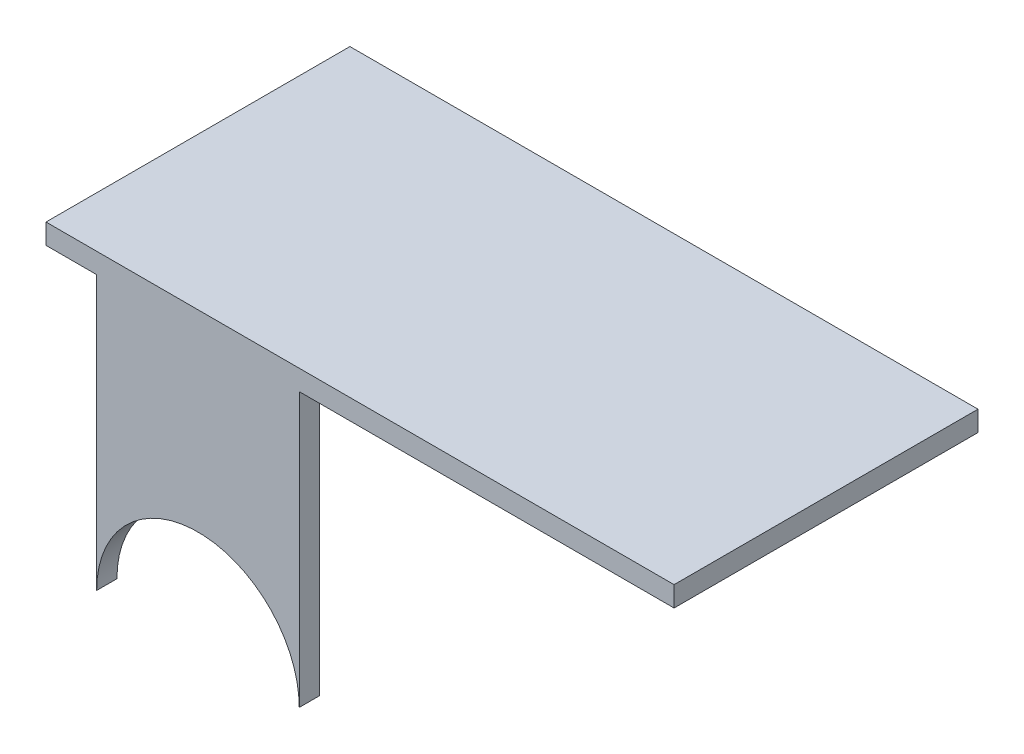
ISO-10303-21;
HEADER;
FILE_DESCRIPTION(('STEP AP214'),'2;1');
FILE_NAME('part.step','',(''),(''),'','','');
FILE_SCHEMA(('AUTOMOTIVE_DESIGN { 1 0 10303 214 1 1 1 1 }'));
ENDSEC;
DATA;
#1=APPLICATION_CONTEXT('core data for automotive mechanical design processes');
#2=APPLICATION_PROTOCOL_DEFINITION('international standard','automotive_design',2000,#1);
#3=PRODUCT_CONTEXT('',#1,'mechanical');
#4=PRODUCT('Part','Part','',(#3));
#5=PRODUCT_RELATED_PRODUCT_CATEGORY('part','',(#4));
#6=PRODUCT_DEFINITION_FORMATION('','',#4);
#7=PRODUCT_DEFINITION_CONTEXT('part definition',#1,'design');
#8=PRODUCT_DEFINITION('design','',#6,#7);
#9=PRODUCT_DEFINITION_SHAPE('','',#8);
#10=(LENGTH_UNIT() NAMED_UNIT(*) SI_UNIT(.MILLI.,.METRE.));
#11=(NAMED_UNIT(*) PLANE_ANGLE_UNIT() SI_UNIT($,.RADIAN.));
#12=(NAMED_UNIT(*) SI_UNIT($,.STERADIAN.) SOLID_ANGLE_UNIT());
#13=UNCERTAINTY_MEASURE_WITH_UNIT(LENGTH_MEASURE(1.E-05),#10,'distance_accuracy_value','');
#14=(GEOMETRIC_REPRESENTATION_CONTEXT(3) GLOBAL_UNCERTAINTY_ASSIGNED_CONTEXT((#13)) GLOBAL_UNIT_ASSIGNED_CONTEXT((#10,
#11,#12)) REPRESENTATION_CONTEXT('',''));
#15=CARTESIAN_POINT('',(0.,0.,0.));
#16=DIRECTION('',(0.,0.,1.));
#17=DIRECTION('',(1.,0.,0.));
#18=AXIS2_PLACEMENT_3D('',#15,#16,#17);
#19=CARTESIAN_POINT('',(-34.9249684990199,-5.13115650933468,2.));
#20=DIRECTION('',(0.,0.,-1.));
#21=DIRECTION('',(-1.,0.,0.));
#22=AXIS2_PLACEMENT_3D('',#19,#20,#21);
#23=CYLINDRICAL_SURFACE('',#22,10.);
#24=CARTESIAN_POINT('',(-34.9249684990199,-5.13115650933468,0.));
#25=DIRECTION('',(0.,0.,-1.));
#26=DIRECTION('',(-1.,0.,0.));
#27=AXIS2_PLACEMENT_3D('',#24,#25,#26);
#28=CIRCLE('',#27,10.);
#29=CARTESIAN_POINT('',(-44.9249684990199,-5.13115650933468,0.));
#30=VERTEX_POINT('',#29);
#31=CARTESIAN_POINT('',(-24.9249684990199,-5.13115650933468,0.));
#32=VERTEX_POINT('',#31);
#33=EDGE_CURVE('E137',#30,#32,#28,.T.);
#34=ORIENTED_EDGE('',*,*,#33,.T.);
#35=DIRECTION('',(0.,0.,-1.));
#36=VECTOR('',#35,1.);
#37=CARTESIAN_POINT('',(-24.9249684990199,-5.13115650933468,2.));
#38=LINE('',#37,#36);
#39=CARTESIAN_POINT('',(-24.9249684990199,-5.13115650933468,2.));
#40=VERTEX_POINT('',#39);
#41=EDGE_CURVE('E11',#40,#32,#38,.T.);
#42=ORIENTED_EDGE('',*,*,#41,.F.);
#43=CARTESIAN_POINT('',(-34.9249684990199,-5.13115650933468,2.));
#44=DIRECTION('',(0.,0.,-1.));
#45=DIRECTION('',(-1.,0.,0.));
#46=AXIS2_PLACEMENT_3D('',#43,#44,#45);
#47=CIRCLE('',#46,10.);
#48=CARTESIAN_POINT('',(-44.9249684990199,-5.13115650933468,2.));
#49=VERTEX_POINT('',#48);
#50=EDGE_CURVE('E148',#49,#40,#47,.T.);
#51=ORIENTED_EDGE('',*,*,#50,.F.);
#52=DIRECTION('',(0.,0.,-1.));
#53=VECTOR('',#52,1.);
#54=CARTESIAN_POINT('',(-44.9249684990199,-5.13115650933468,2.));
#55=LINE('',#54,#53);
#56=EDGE_CURVE('E154',#49,#30,#55,.T.);
#57=ORIENTED_EDGE('',*,*,#56,.T.);
#58=EDGE_LOOP('',(#34,#42,#51,#57));
#59=FACE_BOUND('',#58,.T.);
#60=ADVANCED_FACE('F39',(#59),#23,.F.);
#61=CARTESIAN_POINT('',(-24.9249684990199,21.8688434906653,2.));
#62=DIRECTION('',(-1.,0.,0.));
#63=DIRECTION('',(0.,-1.,0.));
#64=AXIS2_PLACEMENT_3D('',#61,#62,#63);
#65=PLANE('',#64);
#66=DIRECTION('',(0.,1.,0.));
#67=VECTOR('',#66,1.);
#68=CARTESIAN_POINT('',(-24.9249684990199,21.8688434906653,0.));
#69=LINE('',#68,#67);
#70=CARTESIAN_POINT('',(-24.9249684990199,21.8688434906653,0.));
#71=VERTEX_POINT('',#70);
#72=EDGE_CURVE('E142',#32,#71,#69,.T.);
#73=ORIENTED_EDGE('',*,*,#72,.T.);
#74=DIRECTION('',(0.,0.,-1.));
#75=VECTOR('',#74,1.);
#76=CARTESIAN_POINT('',(-24.9249684990199,21.8688434906653,2.));
#77=LINE('',#76,#75);
#78=CARTESIAN_POINT('',(-24.9249684990199,21.8688434906653,2.));
#79=VERTEX_POINT('',#78);
#80=EDGE_CURVE('E48',#79,#71,#77,.T.);
#81=ORIENTED_EDGE('',*,*,#80,.F.);
#82=DIRECTION('',(0.,1.,0.));
#83=VECTOR('',#82,1.);
#84=CARTESIAN_POINT('',(-24.9249684990199,21.8688434906653,2.));
#85=LINE('',#84,#83);
#86=EDGE_CURVE('E80',#40,#79,#85,.T.);
#87=ORIENTED_EDGE('',*,*,#86,.F.);
#88=ORIENTED_EDGE('',*,*,#41,.T.);
#89=EDGE_LOOP('',(#73,#81,#87,#88));
#90=FACE_BOUND('',#89,.T.);
#91=ADVANCED_FACE('F172',(#90),#65,.F.);
#92=CARTESIAN_POINT('',(-44.9249684990199,-5.13115650933468,2.));
#93=DIRECTION('',(1.,0.,0.));
#94=DIRECTION('',(0.,0.,-1.));
#95=AXIS2_PLACEMENT_3D('',#92,#93,#94);
#96=PLANE('',#95);
#97=DIRECTION('',(0.,-1.,0.));
#98=VECTOR('',#97,1.);
#99=CARTESIAN_POINT('',(-44.9249684990199,-5.13115650933468,0.));
#100=LINE('',#99,#98);
#101=CARTESIAN_POINT('',(-44.9249684990199,21.8688434906653,0.));
#102=VERTEX_POINT('',#101);
#103=EDGE_CURVE('E73',#102,#30,#100,.T.);
#104=ORIENTED_EDGE('',*,*,#103,.T.);
#105=ORIENTED_EDGE('',*,*,#56,.F.);
#106=DIRECTION('',(0.,-1.,0.));
#107=VECTOR('',#106,1.);
#108=CARTESIAN_POINT('',(-44.9249684990199,-5.13115650933468,2.));
#109=LINE('',#108,#107);
#110=CARTESIAN_POINT('',(-44.9249684990199,21.8688434906653,2.));
#111=VERTEX_POINT('',#110);
#112=EDGE_CURVE('E56',#111,#49,#109,.T.);
#113=ORIENTED_EDGE('',*,*,#112,.F.);
#114=DIRECTION('',(0.,0.,-1.));
#115=VECTOR('',#114,1.);
#116=CARTESIAN_POINT('',(-44.9249684990199,21.8688434906653,2.));
#117=LINE('',#116,#115);
#118=EDGE_CURVE('E70',#111,#102,#117,.T.);
#119=ORIENTED_EDGE('',*,*,#118,.T.);
#120=EDGE_LOOP('',(#104,#105,#113,#119));
#121=FACE_BOUND('',#120,.T.);
#122=ADVANCED_FACE('F179',(#121),#96,.F.);
#123=CARTESIAN_POINT('',(-34.9249684990199,-5.13115650933468,2.));
#124=DIRECTION('',(0.,0.,-1.));
#125=DIRECTION('',(-1.,0.,0.));
#126=AXIS2_PLACEMENT_3D('',#123,#124,#125);
#127=PLANE('',#126);
#128=ORIENTED_EDGE('',*,*,#50,.T.);
#129=ORIENTED_EDGE('',*,*,#86,.T.);
#130=DIRECTION('',(1.,0.,0.));
#131=VECTOR('',#130,1.);
#132=CARTESIAN_POINT('',(-44.9249684990199,21.8688434906653,2.));
#133=LINE('',#132,#131);
#134=CARTESIAN_POINT('',(12.0750315009801,21.8688434906653,2.));
#135=VERTEX_POINT('',#134);
#136=EDGE_CURVE('E134',#79,#135,#133,.T.);
#137=ORIENTED_EDGE('',*,*,#136,.T.);
#138=DIRECTION('',(0.,-1.,0.));
#139=VECTOR('',#138,1.);
#140=CARTESIAN_POINT('',(12.0750315009801,23.8688434906653,2.));
#141=LINE('',#140,#139);
#142=CARTESIAN_POINT('',(12.0750315009801,23.8688434906653,2.));
#143=VERTEX_POINT('',#142);
#144=EDGE_CURVE('E114',#143,#135,#141,.T.);
#145=ORIENTED_EDGE('',*,*,#144,.F.);
#146=DIRECTION('',(1.,0.,0.));
#147=VECTOR('',#146,1.);
#148=CARTESIAN_POINT('',(-44.9249684990199,23.8688434906653,2.));
#149=LINE('',#148,#147);
#150=CARTESIAN_POINT('',(-49.9249684990199,23.8688434906653,2.));
#151=VERTEX_POINT('',#150);
#152=EDGE_CURVE('E121',#151,#143,#149,.T.);
#153=ORIENTED_EDGE('',*,*,#152,.F.);
#154=DIRECTION('',(0.,-1.,0.));
#155=VECTOR('',#154,1.);
#156=CARTESIAN_POINT('',(-49.9249684990199,23.8688434906653,2.));
#157=LINE('',#156,#155);
#158=CARTESIAN_POINT('',(-49.9249684990199,21.8688434906653,2.));
#159=VERTEX_POINT('',#158);
#160=EDGE_CURVE('E182',#151,#159,#157,.T.);
#161=ORIENTED_EDGE('',*,*,#160,.T.);
#162=EDGE_CURVE('E130',#159,#111,#133,.T.);
#163=ORIENTED_EDGE('',*,*,#162,.T.);
#164=ORIENTED_EDGE('',*,*,#112,.T.);
#165=EDGE_LOOP('',(#128,#129,#137,#145,#153,#161,#163,#164));
#166=FACE_BOUND('',#165,.T.);
#167=ADVANCED_FACE('F132',(#166),#127,.F.);
#168=CARTESIAN_POINT('',(-34.9249684990199,-5.13115650933468,0.));
#169=DIRECTION('',(0.,0.,-1.));
#170=DIRECTION('',(-1.,0.,0.));
#171=AXIS2_PLACEMENT_3D('',#168,#169,#170);
#172=PLANE('',#171);
#173=ORIENTED_EDGE('',*,*,#33,.F.);
#174=ORIENTED_EDGE('',*,*,#103,.F.);
#175=DIRECTION('',(-1.,0.,0.));
#176=VECTOR('',#175,1.);
#177=CARTESIAN_POINT('',(-44.9249684990199,21.8688434906653,0.));
#178=LINE('',#177,#176);
#179=EDGE_CURVE('E159',#71,#102,#178,.T.);
#180=ORIENTED_EDGE('',*,*,#179,.F.);
#181=ORIENTED_EDGE('',*,*,#72,.F.);
#182=EDGE_LOOP('',(#173,#174,#180,#181));
#183=FACE_BOUND('',#182,.T.);
#184=ADVANCED_FACE('F176',(#183),#172,.T.);
#185=CARTESIAN_POINT('',(12.0750315009801,23.8688434906653,2.));
#186=DIRECTION('',(-1.,0.,0.));
#187=DIRECTION('',(0.,0.,1.));
#188=AXIS2_PLACEMENT_3D('',#185,#186,#187);
#189=PLANE('',#188);
#190=DIRECTION('',(0.,0.,-1.));
#191=VECTOR('',#190,1.);
#192=CARTESIAN_POINT('',(12.0750315009801,21.8688434906653,2.));
#193=LINE('',#192,#191);
#194=CARTESIAN_POINT('',(12.0750315009801,21.8688434906653,-28.));
#195=VERTEX_POINT('',#194);
#196=EDGE_CURVE('E201',#135,#195,#193,.T.);
#197=ORIENTED_EDGE('',*,*,#196,.T.);
#198=DIRECTION('',(0.,-1.,0.));
#199=VECTOR('',#198,1.);
#200=CARTESIAN_POINT('',(12.0750315009801,23.8688434906653,-28.));
#201=LINE('',#200,#199);
#202=CARTESIAN_POINT('',(12.0750315009801,23.8688434906653,-28.));
#203=VERTEX_POINT('',#202);
#204=EDGE_CURVE('E116',#203,#195,#201,.T.);
#205=ORIENTED_EDGE('',*,*,#204,.F.);
#206=DIRECTION('',(0.,0.,-1.));
#207=VECTOR('',#206,1.);
#208=CARTESIAN_POINT('',(12.0750315009801,23.8688434906653,2.));
#209=LINE('',#208,#207);
#210=EDGE_CURVE('E110',#143,#203,#209,.T.);
#211=ORIENTED_EDGE('',*,*,#210,.F.);
#212=ORIENTED_EDGE('',*,*,#144,.T.);
#213=EDGE_LOOP('',(#197,#205,#211,#212));
#214=FACE_BOUND('',#213,.T.);
#215=ADVANCED_FACE('F112',(#214),#189,.F.);
#216=CARTESIAN_POINT('',(-49.9249684990199,23.8688434906653,-28.));
#217=DIRECTION('',(0.,0.,1.));
#218=DIRECTION('',(1.,0.,0.));
#219=AXIS2_PLACEMENT_3D('',#216,#217,#218);
#220=PLANE('',#219);
#221=DIRECTION('',(-1.,0.,0.));
#222=VECTOR('',#221,1.);
#223=CARTESIAN_POINT('',(-49.9249684990199,21.8688434906653,-28.));
#224=LINE('',#223,#222);
#225=CARTESIAN_POINT('',(-49.9249684990199,21.8688434906653,-28.));
#226=VERTEX_POINT('',#225);
#227=EDGE_CURVE('E198',#195,#226,#224,.T.);
#228=ORIENTED_EDGE('',*,*,#227,.T.);
#229=DIRECTION('',(0.,-1.,0.));
#230=VECTOR('',#229,1.);
#231=CARTESIAN_POINT('',(-49.9249684990199,23.8688434906653,-28.));
#232=LINE('',#231,#230);
#233=CARTESIAN_POINT('',(-49.9249684990199,23.8688434906653,-28.));
#234=VERTEX_POINT('',#233);
#235=EDGE_CURVE('E144',#234,#226,#232,.T.);
#236=ORIENTED_EDGE('',*,*,#235,.F.);
#237=DIRECTION('',(-1.,0.,0.));
#238=VECTOR('',#237,1.);
#239=CARTESIAN_POINT('',(-49.9249684990199,23.8688434906653,-28.));
#240=LINE('',#239,#238);
#241=EDGE_CURVE('E120',#203,#234,#240,.T.);
#242=ORIENTED_EDGE('',*,*,#241,.F.);
#243=ORIENTED_EDGE('',*,*,#204,.T.);
#244=EDGE_LOOP('',(#228,#236,#242,#243));
#245=FACE_BOUND('',#244,.T.);
#246=ADVANCED_FACE('F208',(#245),#220,.F.);
#247=CARTESIAN_POINT('',(-49.9249684990199,23.8688434906653,2.));
#248=DIRECTION('',(1.,0.,0.));
#249=DIRECTION('',(0.,0.,-1.));
#250=AXIS2_PLACEMENT_3D('',#247,#248,#249);
#251=PLANE('',#250);
#252=DIRECTION('',(0.,0.,1.));
#253=VECTOR('',#252,1.);
#254=CARTESIAN_POINT('',(-49.9249684990199,21.8688434906653,2.));
#255=LINE('',#254,#253);
#256=EDGE_CURVE('E186',#226,#159,#255,.T.);
#257=ORIENTED_EDGE('',*,*,#256,.T.);
#258=ORIENTED_EDGE('',*,*,#160,.F.);
#259=DIRECTION('',(0.,0.,1.));
#260=VECTOR('',#259,1.);
#261=CARTESIAN_POINT('',(-49.9249684990199,23.8688434906653,2.));
#262=LINE('',#261,#260);
#263=EDGE_CURVE('E126',#234,#151,#262,.T.);
#264=ORIENTED_EDGE('',*,*,#263,.F.);
#265=ORIENTED_EDGE('',*,*,#235,.T.);
#266=EDGE_LOOP('',(#257,#258,#264,#265));
#267=FACE_BOUND('',#266,.T.);
#268=ADVANCED_FACE('F195',(#267),#251,.F.);
#269=CARTESIAN_POINT('',(0.,23.8688434906653,0.));
#270=DIRECTION('',(0.,1.,0.));
#271=DIRECTION('',(0.,0.,1.));
#272=AXIS2_PLACEMENT_3D('',#269,#270,#271);
#273=PLANE('',#272);
#274=ORIENTED_EDGE('',*,*,#152,.T.);
#275=ORIENTED_EDGE('',*,*,#210,.T.);
#276=ORIENTED_EDGE('',*,*,#241,.T.);
#277=ORIENTED_EDGE('',*,*,#263,.T.);
#278=EDGE_LOOP('',(#274,#275,#276,#277));
#279=FACE_BOUND('',#278,.T.);
#280=ADVANCED_FACE('F124',(#279),#273,.T.);
#281=CARTESIAN_POINT('',(0.,21.8688434906653,0.));
#282=DIRECTION('',(0.,1.,0.));
#283=DIRECTION('',(0.,0.,1.));
#284=AXIS2_PLACEMENT_3D('',#281,#282,#283);
#285=PLANE('',#284);
#286=ORIENTED_EDGE('',*,*,#118,.F.);
#287=ORIENTED_EDGE('',*,*,#162,.F.);
#288=ORIENTED_EDGE('',*,*,#256,.F.);
#289=ORIENTED_EDGE('',*,*,#227,.F.);
#290=ORIENTED_EDGE('',*,*,#196,.F.);
#291=ORIENTED_EDGE('',*,*,#136,.F.);
#292=ORIENTED_EDGE('',*,*,#80,.T.);
#293=ORIENTED_EDGE('',*,*,#179,.T.);
#294=EDGE_LOOP('',(#286,#287,#288,#289,#290,#291,#292,#293));
#295=FACE_BOUND('',#294,.T.);
#296=ADVANCED_FACE('F171',(#295),#285,.F.);
#297=CLOSED_SHELL('',(#60,#91,#122,#167,#184,#215,#246,#268,#280,#296));
#298=MANIFOLD_SOLID_BREP('B2',#297);
#299=ADVANCED_BREP_SHAPE_REPRESENTATION('',(#18,#298),#14);
#300=SHAPE_DEFINITION_REPRESENTATION(#9,#299);
ENDSEC;
END-ISO-10303-21;
